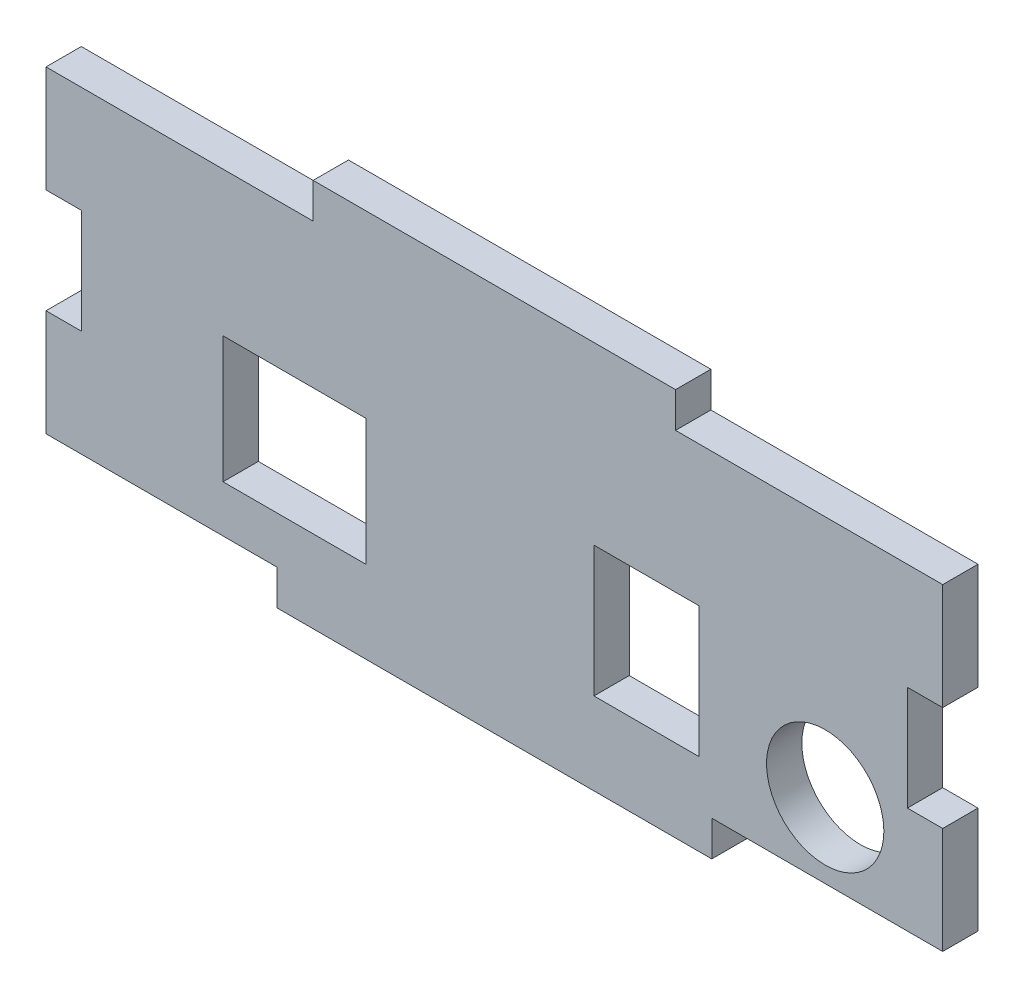
ISO-10303-21;
HEADER;
FILE_DESCRIPTION(('STEP AP214'),'2;1');
FILE_NAME('part.step','',(''),(''),'','','');
FILE_SCHEMA(('AUTOMOTIVE_DESIGN { 1 0 10303 214 1 1 1 1 }'));
ENDSEC;
DATA;
#1=APPLICATION_CONTEXT('core data for automotive mechanical design processes');
#2=APPLICATION_PROTOCOL_DEFINITION('international standard','automotive_design',2000,#1);
#3=PRODUCT_CONTEXT('',#1,'mechanical');
#4=PRODUCT('Part','Part','',(#3));
#5=PRODUCT_RELATED_PRODUCT_CATEGORY('part','',(#4));
#6=PRODUCT_DEFINITION_FORMATION('','',#4);
#7=PRODUCT_DEFINITION_CONTEXT('part definition',#1,'design');
#8=PRODUCT_DEFINITION('design','',#6,#7);
#9=PRODUCT_DEFINITION_SHAPE('','',#8);
#10=(LENGTH_UNIT() NAMED_UNIT(*) SI_UNIT(.MILLI.,.METRE.));
#11=(NAMED_UNIT(*) PLANE_ANGLE_UNIT() SI_UNIT($,.RADIAN.));
#12=(NAMED_UNIT(*) SI_UNIT($,.STERADIAN.) SOLID_ANGLE_UNIT());
#13=UNCERTAINTY_MEASURE_WITH_UNIT(LENGTH_MEASURE(1.E-05),#10,'distance_accuracy_value','');
#14=(GEOMETRIC_REPRESENTATION_CONTEXT(3) GLOBAL_UNCERTAINTY_ASSIGNED_CONTEXT((#13)) GLOBAL_UNIT_ASSIGNED_CONTEXT((#10,
#11,#12)) REPRESENTATION_CONTEXT('',''));
#15=CARTESIAN_POINT('',(0.,0.,0.));
#16=DIRECTION('',(0.,0.,1.));
#17=DIRECTION('',(1.,0.,0.));
#18=AXIS2_PLACEMENT_3D('',#15,#16,#17);
#19=CARTESIAN_POINT('',(-38.1,15.,3.));
#20=DIRECTION('',(0.,-1.,0.));
#21=DIRECTION('',(0.,0.,-1.));
#22=AXIS2_PLACEMENT_3D('',#19,#20,#21);
#23=PLANE('',#22);
#24=DIRECTION('',(0.,0.,1.));
#25=VECTOR('',#24,1.);
#26=CARTESIAN_POINT('',(-15.39875,15.,-30.9432707749197));
#27=LINE('',#26,#25);
#28=CARTESIAN_POINT('',(-15.39875,15.,0.));
#29=VERTEX_POINT('',#28);
#30=CARTESIAN_POINT('',(-15.39875,15.,3.));
#31=VERTEX_POINT('',#30);
#32=EDGE_CURVE('E244',#29,#31,#27,.T.);
#33=ORIENTED_EDGE('',*,*,#32,.F.);
#34=DIRECTION('',(-1.,0.,0.));
#35=VECTOR('',#34,1.);
#36=CARTESIAN_POINT('',(-38.1,15.,0.));
#37=LINE('',#36,#35);
#38=CARTESIAN_POINT('',(-38.1,15.,0.));
#39=VERTEX_POINT('',#38);
#40=EDGE_CURVE('E240',#29,#39,#37,.T.);
#41=ORIENTED_EDGE('',*,*,#40,.T.);
#42=DIRECTION('',(0.,0.,-1.));
#43=VECTOR('',#42,1.);
#44=CARTESIAN_POINT('',(-38.1,15.,3.));
#45=LINE('',#44,#43);
#46=CARTESIAN_POINT('',(-38.1,15.,3.));
#47=VERTEX_POINT('',#46);
#48=EDGE_CURVE('E54',#47,#39,#45,.T.);
#49=ORIENTED_EDGE('',*,*,#48,.F.);
#50=DIRECTION('',(-1.,0.,0.));
#51=VECTOR('',#50,1.);
#52=CARTESIAN_POINT('',(-38.1,15.,3.));
#53=LINE('',#52,#51);
#54=EDGE_CURVE('E488',#31,#47,#53,.T.);
#55=ORIENTED_EDGE('',*,*,#54,.F.);
#56=EDGE_LOOP('',(#33,#41,#49,#55));
#57=FACE_BOUND('',#56,.T.);
#58=ADVANCED_FACE('F45',(#57),#23,.F.);
#59=CARTESIAN_POINT('',(38.1,-15.,3.));
#60=DIRECTION('',(-1.,0.,0.));
#61=DIRECTION('',(0.,0.,1.));
#62=AXIS2_PLACEMENT_3D('',#59,#60,#61);
#63=PLANE('',#62);
#64=DIRECTION('',(0.,1.,0.));
#65=VECTOR('',#64,1.);
#66=CARTESIAN_POINT('',(38.1,-15.,3.));
#67=LINE('',#66,#65);
#68=CARTESIAN_POINT('',(38.1,5.94500000000001,3.));
#69=VERTEX_POINT('',#68);
#70=CARTESIAN_POINT('',(38.1,15.,3.));
#71=VERTEX_POINT('',#70);
#72=EDGE_CURVE('E489',#69,#71,#67,.T.);
#73=ORIENTED_EDGE('',*,*,#72,.F.);
#74=DIRECTION('',(0.,0.,1.));
#75=VECTOR('',#74,1.);
#76=CARTESIAN_POINT('',(38.1,5.94500000000001,-9.38254229939839));
#77=LINE('',#76,#75);
#78=CARTESIAN_POINT('',(38.1,5.94500000000001,0.));
#79=VERTEX_POINT('',#78);
#80=EDGE_CURVE('E277',#79,#69,#77,.T.);
#81=ORIENTED_EDGE('',*,*,#80,.F.);
#82=DIRECTION('',(0.,1.,0.));
#83=VECTOR('',#82,1.);
#84=CARTESIAN_POINT('',(38.1,-15.,0.));
#85=LINE('',#84,#83);
#86=CARTESIAN_POINT('',(38.1,15.,0.));
#87=VERTEX_POINT('',#86);
#88=EDGE_CURVE('E483',#79,#87,#85,.T.);
#89=ORIENTED_EDGE('',*,*,#88,.T.);
#90=DIRECTION('',(0.,0.,-1.));
#91=VECTOR('',#90,1.);
#92=CARTESIAN_POINT('',(38.1,15.,3.));
#93=LINE('',#92,#91);
#94=EDGE_CURVE('E11',#71,#87,#93,.T.);
#95=ORIENTED_EDGE('',*,*,#94,.F.);
#96=EDGE_LOOP('',(#73,#81,#89,#95));
#97=FACE_BOUND('',#96,.T.);
#98=ADVANCED_FACE('F551',(#97),#63,.F.);
#99=CARTESIAN_POINT('',(-38.1,-15.,3.));
#100=DIRECTION('',(1.,0.,0.));
#101=DIRECTION('',(0.,0.,-1.));
#102=AXIS2_PLACEMENT_3D('',#99,#100,#101);
#103=PLANE('',#102);
#104=DIRECTION('',(0.,-1.,0.));
#105=VECTOR('',#104,1.);
#106=CARTESIAN_POINT('',(-38.1,-15.,3.));
#107=LINE('',#106,#105);
#108=CARTESIAN_POINT('',(-38.1,-2.94499999999998,3.));
#109=VERTEX_POINT('',#108);
#110=CARTESIAN_POINT('',(-38.1,-12.,3.));
#111=VERTEX_POINT('',#110);
#112=EDGE_CURVE('E494',#109,#111,#107,.T.);
#113=ORIENTED_EDGE('',*,*,#112,.F.);
#114=DIRECTION('',(0.,0.,1.));
#115=VECTOR('',#114,1.);
#116=CARTESIAN_POINT('',(-38.1,-2.94499999999998,-9.38254229939839));
#117=LINE('',#116,#115);
#118=CARTESIAN_POINT('',(-38.1,-2.94499999999998,0.));
#119=VERTEX_POINT('',#118);
#120=EDGE_CURVE('E307',#119,#109,#117,.T.);
#121=ORIENTED_EDGE('',*,*,#120,.F.);
#122=DIRECTION('',(0.,-1.,0.));
#123=VECTOR('',#122,1.);
#124=CARTESIAN_POINT('',(-38.1,-15.,0.));
#125=LINE('',#124,#123);
#126=CARTESIAN_POINT('',(-38.1,-12.,0.));
#127=VERTEX_POINT('',#126);
#128=EDGE_CURVE('E511',#119,#127,#125,.T.);
#129=ORIENTED_EDGE('',*,*,#128,.T.);
#130=DIRECTION('',(0.,0.,1.));
#131=VECTOR('',#130,1.);
#132=CARTESIAN_POINT('',(-38.1,-12.,-19.8495154159994));
#133=LINE('',#132,#131);
#134=EDGE_CURVE('E361',#127,#111,#133,.T.);
#135=ORIENTED_EDGE('',*,*,#134,.T.);
#136=EDGE_LOOP('',(#113,#121,#129,#135));
#137=FACE_BOUND('',#136,.T.);
#138=ADVANCED_FACE('F589',(#137),#103,.F.);
#139=CARTESIAN_POINT('',(0.,0.,3.));
#140=DIRECTION('',(0.,0.,-1.));
#141=DIRECTION('',(-1.,0.,0.));
#142=AXIS2_PLACEMENT_3D('',#139,#140,#141);
#143=PLANE('',#142);
#144=CARTESIAN_POINT('',(28.115,-5.65,3.));
#145=DIRECTION('',(0.,0.,1.));
#146=DIRECTION('',(1.,0.,0.));
#147=AXIS2_PLACEMENT_3D('',#144,#145,#146);
#148=CIRCLE('',#147,4.98475);
#149=CARTESIAN_POINT('',(33.09975,-5.65,3.));
#150=VERTEX_POINT('',#149);
#151=EDGE_CURVE('E696',#150,#150,#148,.T.);
#152=ORIENTED_EDGE('',*,*,#151,.F.);
#153=EDGE_LOOP('',(#152));
#154=FACE_BOUND('',#153,.T.);
#155=DIRECTION('',(0.,-1.,0.));
#156=VECTOR('',#155,1.);
#157=CARTESIAN_POINT('',(8.4639,-8.0122,3.));
#158=LINE('',#157,#156);
#159=CARTESIAN_POINT('',(8.4639,3.0876,3.));
#160=VERTEX_POINT('',#159);
#161=CARTESIAN_POINT('',(8.4639,-8.0122,3.));
#162=VERTEX_POINT('',#161);
#163=EDGE_CURVE('E441',#160,#162,#158,.T.);
#164=ORIENTED_EDGE('',*,*,#163,.F.);
#165=DIRECTION('',(-1.,0.,0.));
#166=VECTOR('',#165,1.);
#167=CARTESIAN_POINT('',(8.4639,3.0876,3.));
#168=LINE('',#167,#166);
#169=CARTESIAN_POINT('',(17.4047,3.0876,3.));
#170=VERTEX_POINT('',#169);
#171=EDGE_CURVE('E452',#170,#160,#168,.T.);
#172=ORIENTED_EDGE('',*,*,#171,.F.);
#173=DIRECTION('',(0.,1.,0.));
#174=VECTOR('',#173,1.);
#175=CARTESIAN_POINT('',(17.4047,-8.0122,3.));
#176=LINE('',#175,#174);
#177=CARTESIAN_POINT('',(17.4047,-8.0122,3.));
#178=VERTEX_POINT('',#177);
#179=EDGE_CURVE('E448',#178,#170,#176,.T.);
#180=ORIENTED_EDGE('',*,*,#179,.F.);
#181=DIRECTION('',(1.,0.,0.));
#182=VECTOR('',#181,1.);
#183=CARTESIAN_POINT('',(8.4639,-8.0122,3.));
#184=LINE('',#183,#182);
#185=EDGE_CURVE('E444',#162,#178,#184,.T.);
#186=ORIENTED_EDGE('',*,*,#185,.F.);
#187=EDGE_LOOP('',(#164,#172,#180,#186));
#188=FACE_BOUND('',#187,.T.);
#189=DIRECTION('',(0.,1.,0.));
#190=VECTOR('',#189,1.);
#191=CARTESIAN_POINT('',(-35.1,-2.94499999999998,3.));
#192=LINE('',#191,#190);
#193=CARTESIAN_POINT('',(-35.1,-2.94499999999998,3.));
#194=VERTEX_POINT('',#193);
#195=CARTESIAN_POINT('',(-35.1,5.94500000000001,3.));
#196=VERTEX_POINT('',#195);
#197=EDGE_CURVE('E282',#194,#196,#192,.T.);
#198=ORIENTED_EDGE('',*,*,#197,.F.);
#199=DIRECTION('',(1.,0.,0.));
#200=VECTOR('',#199,1.);
#201=CARTESIAN_POINT('',(-38.1,-2.94499999999998,3.));
#202=LINE('',#201,#200);
#203=EDGE_CURVE('E286',#109,#194,#202,.T.);
#204=ORIENTED_EDGE('',*,*,#203,.F.);
#205=ORIENTED_EDGE('',*,*,#112,.T.);
#206=DIRECTION('',(-1.,0.,0.));
#207=VECTOR('',#206,1.);
#208=CARTESIAN_POINT('',(-38.1,-12.,3.));
#209=LINE('',#208,#207);
#210=CARTESIAN_POINT('',(-18.4785,-12.,3.));
#211=VERTEX_POINT('',#210);
#212=EDGE_CURVE('E347',#211,#111,#209,.T.);
#213=ORIENTED_EDGE('',*,*,#212,.F.);
#214=DIRECTION('',(0.,1.,0.));
#215=VECTOR('',#214,1.);
#216=CARTESIAN_POINT('',(-18.4785,-15.,3.));
#217=LINE('',#216,#215);
#218=CARTESIAN_POINT('',(-18.4785,-15.,3.));
#219=VERTEX_POINT('',#218);
#220=EDGE_CURVE('E352',#219,#211,#217,.T.);
#221=ORIENTED_EDGE('',*,*,#220,.F.);
#222=DIRECTION('',(1.,0.,0.));
#223=VECTOR('',#222,1.);
#224=CARTESIAN_POINT('',(-38.1,-15.,3.));
#225=LINE('',#224,#223);
#226=CARTESIAN_POINT('',(18.4785,-15.,3.));
#227=VERTEX_POINT('',#226);
#228=EDGE_CURVE('E499',#219,#227,#225,.T.);
#229=ORIENTED_EDGE('',*,*,#228,.T.);
#230=DIRECTION('',(0.,-1.,0.));
#231=VECTOR('',#230,1.);
#232=CARTESIAN_POINT('',(18.4785,-15.,3.));
#233=LINE('',#232,#231);
#234=CARTESIAN_POINT('',(18.4785,-12.,3.));
#235=VERTEX_POINT('',#234);
#236=EDGE_CURVE('E356',#235,#227,#233,.T.);
#237=ORIENTED_EDGE('',*,*,#236,.F.);
#238=DIRECTION('',(-1.,0.,0.));
#239=VECTOR('',#238,1.);
#240=CARTESIAN_POINT('',(18.4785,-12.,3.));
#241=LINE('',#240,#239);
#242=CARTESIAN_POINT('',(38.1,-12.,3.));
#243=VERTEX_POINT('',#242);
#244=EDGE_CURVE('E382',#243,#235,#241,.T.);
#245=ORIENTED_EDGE('',*,*,#244,.F.);
#246=CARTESIAN_POINT('',(38.1,-2.94499999999999,3.));
#247=VERTEX_POINT('',#246);
#248=EDGE_CURVE('E484',#243,#247,#67,.T.);
#249=ORIENTED_EDGE('',*,*,#248,.T.);
#250=DIRECTION('',(1.,0.,0.));
#251=VECTOR('',#250,1.);
#252=CARTESIAN_POINT('',(38.1,-2.94499999999999,3.));
#253=LINE('',#252,#251);
#254=CARTESIAN_POINT('',(35.1,-2.94499999999999,3.));
#255=VERTEX_POINT('',#254);
#256=EDGE_CURVE('E69',#255,#247,#253,.T.);
#257=ORIENTED_EDGE('',*,*,#256,.F.);
#258=DIRECTION('',(0.,-1.,0.));
#259=VECTOR('',#258,1.);
#260=CARTESIAN_POINT('',(35.1,5.94500000000001,3.));
#261=LINE('',#260,#259);
#262=CARTESIAN_POINT('',(35.1,5.94500000000001,3.));
#263=VERTEX_POINT('',#262);
#264=EDGE_CURVE('E341',#263,#255,#261,.T.);
#265=ORIENTED_EDGE('',*,*,#264,.F.);
#266=DIRECTION('',(-1.,0.,0.));
#267=VECTOR('',#266,1.);
#268=CARTESIAN_POINT('',(38.1,5.94500000000001,3.));
#269=LINE('',#268,#267);
#270=EDGE_CURVE('E290',#69,#263,#269,.T.);
#271=ORIENTED_EDGE('',*,*,#270,.F.);
#272=ORIENTED_EDGE('',*,*,#72,.T.);
#273=CARTESIAN_POINT('',(15.39875,15.,3.));
#274=VERTEX_POINT('',#273);
#275=EDGE_CURVE('E490',#71,#274,#53,.T.);
#276=ORIENTED_EDGE('',*,*,#275,.T.);
#277=DIRECTION('',(0.,1.,0.));
#278=VECTOR('',#277,1.);
#279=CARTESIAN_POINT('',(15.39875,18.,3.));
#280=LINE('',#279,#278);
#281=CARTESIAN_POINT('',(15.39875,18.,3.));
#282=VERTEX_POINT('',#281);
#283=EDGE_CURVE('E61',#274,#282,#280,.T.);
#284=ORIENTED_EDGE('',*,*,#283,.T.);
#285=DIRECTION('',(-1.,0.,0.));
#286=VECTOR('',#285,1.);
#287=CARTESIAN_POINT('',(-15.39875,18.,3.));
#288=LINE('',#287,#286);
#289=CARTESIAN_POINT('',(-15.39875,18.,3.));
#290=VERTEX_POINT('',#289);
#291=EDGE_CURVE('E262',#282,#290,#288,.T.);
#292=ORIENTED_EDGE('',*,*,#291,.T.);
#293=DIRECTION('',(0.,-1.,0.));
#294=VECTOR('',#293,1.);
#295=CARTESIAN_POINT('',(-15.39875,18.,3.));
#296=LINE('',#295,#294);
#297=EDGE_CURVE('E250',#290,#31,#296,.T.);
#298=ORIENTED_EDGE('',*,*,#297,.T.);
#299=ORIENTED_EDGE('',*,*,#54,.T.);
#300=CARTESIAN_POINT('',(-38.1,5.94500000000001,3.));
#301=VERTEX_POINT('',#300);
#302=EDGE_CURVE('E495',#47,#301,#107,.T.);
#303=ORIENTED_EDGE('',*,*,#302,.T.);
#304=DIRECTION('',(-1.,0.,0.));
#305=VECTOR('',#304,1.);
#306=CARTESIAN_POINT('',(-38.1,5.94500000000001,3.));
#307=LINE('',#306,#305);
#308=EDGE_CURVE('E278',#196,#301,#307,.T.);
#309=ORIENTED_EDGE('',*,*,#308,.F.);
#310=EDGE_LOOP('',(#198,#204,#205,#213,#221,#229,#237,#245,#249,#257,#265,#271,#272,#276,#284,
#292,#298,#299,#303,#309));
#311=FACE_BOUND('',#310,.T.);
#312=DIRECTION('',(0.,-1.,0.));
#313=VECTOR('',#312,1.);
#314=CARTESIAN_POINT('',(-23.0575,-8.0122,3.));
#315=LINE('',#314,#313);
#316=CARTESIAN_POINT('',(-23.0575,2.732,3.));
#317=VERTEX_POINT('',#316);
#318=CARTESIAN_POINT('',(-23.0575,-8.0122,3.));
#319=VERTEX_POINT('',#318);
#320=EDGE_CURVE('E398',#317,#319,#315,.T.);
#321=ORIENTED_EDGE('',*,*,#320,.F.);
#322=DIRECTION('',(-1.,0.,0.));
#323=VECTOR('',#322,1.);
#324=CARTESIAN_POINT('',(-23.0575,2.732,3.));
#325=LINE('',#324,#323);
#326=CARTESIAN_POINT('',(-10.9036,2.732,3.));
#327=VERTEX_POINT('',#326);
#328=EDGE_CURVE('E409',#327,#317,#325,.T.);
#329=ORIENTED_EDGE('',*,*,#328,.F.);
#330=DIRECTION('',(0.,1.,0.));
#331=VECTOR('',#330,1.);
#332=CARTESIAN_POINT('',(-10.9036,-8.0122,3.));
#333=LINE('',#332,#331);
#334=CARTESIAN_POINT('',(-10.9036,-8.0122,3.));
#335=VERTEX_POINT('',#334);
#336=EDGE_CURVE('E405',#335,#327,#333,.T.);
#337=ORIENTED_EDGE('',*,*,#336,.F.);
#338=DIRECTION('',(1.,0.,0.));
#339=VECTOR('',#338,1.);
#340=CARTESIAN_POINT('',(-23.0575,-8.0122,3.));
#341=LINE('',#340,#339);
#342=EDGE_CURVE('E401',#319,#335,#341,.T.);
#343=ORIENTED_EDGE('',*,*,#342,.F.);
#344=EDGE_LOOP('',(#321,#329,#337,#343));
#345=FACE_BOUND('',#344,.T.);
#346=ADVANCED_FACE('F537',(#154,#188,#311,#345),#143,.F.);
#347=CARTESIAN_POINT('',(0.,0.,0.));
#348=DIRECTION('',(0.,0.,-1.));
#349=DIRECTION('',(-1.,0.,0.));
#350=AXIS2_PLACEMENT_3D('',#347,#348,#349);
#351=PLANE('',#350);
#352=CARTESIAN_POINT('',(28.115,-5.65,0.));
#353=DIRECTION('',(0.,0.,-1.));
#354=DIRECTION('',(-1.,0.,0.));
#355=AXIS2_PLACEMENT_3D('',#352,#353,#354);
#356=CIRCLE('',#355,4.98475);
#357=CARTESIAN_POINT('',(23.13025,-5.65,0.));
#358=VERTEX_POINT('',#357);
#359=EDGE_CURVE('E698',#358,#358,#356,.F.);
#360=ORIENTED_EDGE('',*,*,#359,.T.);
#361=EDGE_LOOP('',(#360));
#362=FACE_BOUND('',#361,.T.);
#363=DIRECTION('',(1.,0.,0.));
#364=VECTOR('',#363,1.);
#365=CARTESIAN_POINT('',(-38.1,-2.94499999999998,0.));
#366=LINE('',#365,#364);
#367=CARTESIAN_POINT('',(-35.1,-2.94499999999998,0.));
#368=VERTEX_POINT('',#367);
#369=EDGE_CURVE('E281',#119,#368,#366,.T.);
#370=ORIENTED_EDGE('',*,*,#369,.T.);
#371=DIRECTION('',(0.,1.,0.));
#372=VECTOR('',#371,1.);
#373=CARTESIAN_POINT('',(-35.1,-2.94499999999998,0.));
#374=LINE('',#373,#372);
#375=CARTESIAN_POINT('',(-35.1,5.94500000000001,0.));
#376=VERTEX_POINT('',#375);
#377=EDGE_CURVE('E300',#368,#376,#374,.T.);
#378=ORIENTED_EDGE('',*,*,#377,.T.);
#379=DIRECTION('',(-1.,0.,0.));
#380=VECTOR('',#379,1.);
#381=CARTESIAN_POINT('',(-38.1,5.94500000000001,0.));
#382=LINE('',#381,#380);
#383=CARTESIAN_POINT('',(-38.1,5.94500000000001,0.));
#384=VERTEX_POINT('',#383);
#385=EDGE_CURVE('E294',#376,#384,#382,.T.);
#386=ORIENTED_EDGE('',*,*,#385,.T.);
#387=EDGE_CURVE('E512',#39,#384,#125,.T.);
#388=ORIENTED_EDGE('',*,*,#387,.F.);
#389=ORIENTED_EDGE('',*,*,#40,.F.);
#390=DIRECTION('',(0.,-1.,0.));
#391=VECTOR('',#390,1.);
#392=CARTESIAN_POINT('',(-15.39875,18.,0.));
#393=LINE('',#392,#391);
#394=CARTESIAN_POINT('',(-15.39875,18.,0.));
#395=VERTEX_POINT('',#394);
#396=EDGE_CURVE('E231',#395,#29,#393,.T.);
#397=ORIENTED_EDGE('',*,*,#396,.F.);
#398=DIRECTION('',(-1.,0.,0.));
#399=VECTOR('',#398,1.);
#400=CARTESIAN_POINT('',(-15.39875,18.,0.));
#401=LINE('',#400,#399);
#402=CARTESIAN_POINT('',(15.39875,18.,0.));
#403=VERTEX_POINT('',#402);
#404=EDGE_CURVE('E237',#403,#395,#401,.T.);
#405=ORIENTED_EDGE('',*,*,#404,.F.);
#406=DIRECTION('',(0.,1.,0.));
#407=VECTOR('',#406,1.);
#408=CARTESIAN_POINT('',(15.39875,18.,0.));
#409=LINE('',#408,#407);
#410=CARTESIAN_POINT('',(15.39875,15.,0.));
#411=VERTEX_POINT('',#410);
#412=EDGE_CURVE('E267',#411,#403,#409,.T.);
#413=ORIENTED_EDGE('',*,*,#412,.F.);
#414=EDGE_CURVE('E507',#87,#411,#37,.T.);
#415=ORIENTED_EDGE('',*,*,#414,.F.);
#416=ORIENTED_EDGE('',*,*,#88,.F.);
#417=DIRECTION('',(-1.,0.,0.));
#418=VECTOR('',#417,1.);
#419=CARTESIAN_POINT('',(38.1,5.94500000000001,0.));
#420=LINE('',#419,#418);
#421=CARTESIAN_POINT('',(35.1,5.94500000000001,0.));
#422=VERTEX_POINT('',#421);
#423=EDGE_CURVE('E321',#79,#422,#420,.T.);
#424=ORIENTED_EDGE('',*,*,#423,.T.);
#425=DIRECTION('',(0.,-1.,0.));
#426=VECTOR('',#425,1.);
#427=CARTESIAN_POINT('',(35.1,5.94500000000001,0.));
#428=LINE('',#427,#426);
#429=CARTESIAN_POINT('',(35.1,-2.94499999999999,0.));
#430=VERTEX_POINT('',#429);
#431=EDGE_CURVE('E322',#422,#430,#428,.T.);
#432=ORIENTED_EDGE('',*,*,#431,.T.);
#433=DIRECTION('',(1.,0.,0.));
#434=VECTOR('',#433,1.);
#435=CARTESIAN_POINT('',(38.1,-2.94499999999999,0.));
#436=LINE('',#435,#434);
#437=CARTESIAN_POINT('',(38.1,-2.94499999999999,0.));
#438=VERTEX_POINT('',#437);
#439=EDGE_CURVE('E326',#430,#438,#436,.T.);
#440=ORIENTED_EDGE('',*,*,#439,.T.);
#441=CARTESIAN_POINT('',(38.1,-12.,0.));
#442=VERTEX_POINT('',#441);
#443=EDGE_CURVE('E503',#442,#438,#85,.T.);
#444=ORIENTED_EDGE('',*,*,#443,.F.);
#445=DIRECTION('',(-1.,0.,0.));
#446=VECTOR('',#445,1.);
#447=CARTESIAN_POINT('',(18.4785,-12.,0.));
#448=LINE('',#447,#446);
#449=CARTESIAN_POINT('',(18.4785,-12.,0.));
#450=VERTEX_POINT('',#449);
#451=EDGE_CURVE('E383',#442,#450,#448,.T.);
#452=ORIENTED_EDGE('',*,*,#451,.T.);
#453=DIRECTION('',(0.,-1.,0.));
#454=VECTOR('',#453,1.);
#455=CARTESIAN_POINT('',(18.4785,-15.,0.));
#456=LINE('',#455,#454);
#457=CARTESIAN_POINT('',(18.4785,-15.,0.));
#458=VERTEX_POINT('',#457);
#459=EDGE_CURVE('E378',#450,#458,#456,.T.);
#460=ORIENTED_EDGE('',*,*,#459,.T.);
#461=DIRECTION('',(1.,0.,0.));
#462=VECTOR('',#461,1.);
#463=CARTESIAN_POINT('',(-38.1,-15.,0.));
#464=LINE('',#463,#462);
#465=CARTESIAN_POINT('',(-18.4785,-15.,0.));
#466=VERTEX_POINT('',#465);
#467=EDGE_CURVE('E516',#466,#458,#464,.T.);
#468=ORIENTED_EDGE('',*,*,#467,.F.);
#469=DIRECTION('',(0.,1.,0.));
#470=VECTOR('',#469,1.);
#471=CARTESIAN_POINT('',(-18.4785,-15.,0.));
#472=LINE('',#471,#470);
#473=CARTESIAN_POINT('',(-18.4785,-12.,0.));
#474=VERTEX_POINT('',#473);
#475=EDGE_CURVE('E363',#466,#474,#472,.T.);
#476=ORIENTED_EDGE('',*,*,#475,.T.);
#477=DIRECTION('',(-1.,0.,0.));
#478=VECTOR('',#477,1.);
#479=CARTESIAN_POINT('',(-38.1,-12.,0.));
#480=LINE('',#479,#478);
#481=EDGE_CURVE('E357',#474,#127,#480,.T.);
#482=ORIENTED_EDGE('',*,*,#481,.T.);
#483=ORIENTED_EDGE('',*,*,#128,.F.);
#484=EDGE_LOOP('',(#370,#378,#386,#388,#389,#397,#405,#413,#415,#416,#424,#432,#440,#444,#452,
#460,#468,#476,#482,#483));
#485=FACE_BOUND('',#484,.T.);
#486=DIRECTION('',(-1.,0.,0.));
#487=VECTOR('',#486,1.);
#488=CARTESIAN_POINT('',(8.4639,3.0876,0.));
#489=LINE('',#488,#487);
#490=CARTESIAN_POINT('',(17.4047,3.0876,0.));
#491=VERTEX_POINT('',#490);
#492=CARTESIAN_POINT('',(8.4639,3.0876,0.));
#493=VERTEX_POINT('',#492);
#494=EDGE_CURVE('E445',#491,#493,#489,.T.);
#495=ORIENTED_EDGE('',*,*,#494,.T.);
#496=DIRECTION('',(0.,-1.,0.));
#497=VECTOR('',#496,1.);
#498=CARTESIAN_POINT('',(8.4639,-8.0122,0.));
#499=LINE('',#498,#497);
#500=CARTESIAN_POINT('',(8.4639,-8.0122,0.));
#501=VERTEX_POINT('',#500);
#502=EDGE_CURVE('E440',#493,#501,#499,.T.);
#503=ORIENTED_EDGE('',*,*,#502,.T.);
#504=DIRECTION('',(1.,0.,0.));
#505=VECTOR('',#504,1.);
#506=CARTESIAN_POINT('',(8.4639,-8.0122,0.));
#507=LINE('',#506,#505);
#508=CARTESIAN_POINT('',(17.4047,-8.0122,0.));
#509=VERTEX_POINT('',#508);
#510=EDGE_CURVE('E459',#501,#509,#507,.T.);
#511=ORIENTED_EDGE('',*,*,#510,.T.);
#512=DIRECTION('',(0.,1.,0.));
#513=VECTOR('',#512,1.);
#514=CARTESIAN_POINT('',(17.4047,-8.0122,0.));
#515=LINE('',#514,#513);
#516=EDGE_CURVE('E463',#509,#491,#515,.T.);
#517=ORIENTED_EDGE('',*,*,#516,.T.);
#518=EDGE_LOOP('',(#495,#503,#511,#517));
#519=FACE_BOUND('',#518,.T.);
#520=DIRECTION('',(-1.,0.,0.));
#521=VECTOR('',#520,1.);
#522=CARTESIAN_POINT('',(-23.0575,2.732,0.));
#523=LINE('',#522,#521);
#524=CARTESIAN_POINT('',(-10.9036,2.732,0.));
#525=VERTEX_POINT('',#524);
#526=CARTESIAN_POINT('',(-23.0575,2.732,0.));
#527=VERTEX_POINT('',#526);
#528=EDGE_CURVE('E402',#525,#527,#523,.T.);
#529=ORIENTED_EDGE('',*,*,#528,.T.);
#530=DIRECTION('',(0.,-1.,0.));
#531=VECTOR('',#530,1.);
#532=CARTESIAN_POINT('',(-23.0575,-8.0122,0.));
#533=LINE('',#532,#531);
#534=CARTESIAN_POINT('',(-23.0575,-8.0122,0.));
#535=VERTEX_POINT('',#534);
#536=EDGE_CURVE('E370',#527,#535,#533,.T.);
#537=ORIENTED_EDGE('',*,*,#536,.T.);
#538=DIRECTION('',(1.,0.,0.));
#539=VECTOR('',#538,1.);
#540=CARTESIAN_POINT('',(-23.0575,-8.0122,0.));
#541=LINE('',#540,#539);
#542=CARTESIAN_POINT('',(-10.9036,-8.0122,0.));
#543=VERTEX_POINT('',#542);
#544=EDGE_CURVE('E416',#535,#543,#541,.T.);
#545=ORIENTED_EDGE('',*,*,#544,.T.);
#546=DIRECTION('',(0.,1.,0.));
#547=VECTOR('',#546,1.);
#548=CARTESIAN_POINT('',(-10.9036,-8.0122,0.));
#549=LINE('',#548,#547);
#550=EDGE_CURVE('E420',#543,#525,#549,.T.);
#551=ORIENTED_EDGE('',*,*,#550,.T.);
#552=EDGE_LOOP('',(#529,#537,#545,#551));
#553=FACE_BOUND('',#552,.T.);
#554=ADVANCED_FACE('F234',(#362,#485,#519,#553),#351,.T.);
#555=ORIENTED_EDGE('',*,*,#443,.T.);
#556=DIRECTION('',(0.,0.,1.));
#557=VECTOR('',#556,1.);
#558=CARTESIAN_POINT('',(38.1,-2.94499999999999,-9.38254229939839));
#559=LINE('',#558,#557);
#560=EDGE_CURVE('E317',#438,#247,#559,.T.);
#561=ORIENTED_EDGE('',*,*,#560,.T.);
#562=ORIENTED_EDGE('',*,*,#248,.F.);
#563=DIRECTION('',(0.,0.,1.));
#564=VECTOR('',#563,1.);
#565=CARTESIAN_POINT('',(38.1,-12.,-19.8495154159994));
#566=LINE('',#565,#564);
#567=EDGE_CURVE('E379',#442,#243,#566,.T.);
#568=ORIENTED_EDGE('',*,*,#567,.F.);
#569=EDGE_LOOP('',(#555,#561,#562,#568));
#570=FACE_BOUND('',#569,.T.);
#571=ADVANCED_FACE('F47',(#570),#63,.F.);
#572=ORIENTED_EDGE('',*,*,#414,.T.);
#573=DIRECTION('',(0.,0.,1.));
#574=VECTOR('',#573,1.);
#575=CARTESIAN_POINT('',(15.39875,15.,-30.9432707749197));
#576=LINE('',#575,#574);
#577=EDGE_CURVE('E269',#411,#274,#576,.T.);
#578=ORIENTED_EDGE('',*,*,#577,.T.);
#579=ORIENTED_EDGE('',*,*,#275,.F.);
#580=ORIENTED_EDGE('',*,*,#94,.T.);
#581=EDGE_LOOP('',(#572,#578,#579,#580));
#582=FACE_BOUND('',#581,.T.);
#583=ADVANCED_FACE('F554',(#582),#23,.F.);
#584=ORIENTED_EDGE('',*,*,#387,.T.);
#585=DIRECTION('',(0.,0.,1.));
#586=VECTOR('',#585,1.);
#587=CARTESIAN_POINT('',(-38.1,5.94500000000001,-9.38254229939839));
#588=LINE('',#587,#586);
#589=EDGE_CURVE('E298',#384,#301,#588,.T.);
#590=ORIENTED_EDGE('',*,*,#589,.T.);
#591=ORIENTED_EDGE('',*,*,#302,.F.);
#592=ORIENTED_EDGE('',*,*,#48,.T.);
#593=EDGE_LOOP('',(#584,#590,#591,#592));
#594=FACE_BOUND('',#593,.T.);
#595=ADVANCED_FACE('F524',(#594),#103,.F.);
#596=CARTESIAN_POINT('',(-38.1,-15.,3.));
#597=DIRECTION('',(0.,1.,0.));
#598=DIRECTION('',(0.,0.,1.));
#599=AXIS2_PLACEMENT_3D('',#596,#597,#598);
#600=PLANE('',#599);
#601=ORIENTED_EDGE('',*,*,#228,.F.);
#602=DIRECTION('',(0.,0.,1.));
#603=VECTOR('',#602,1.);
#604=CARTESIAN_POINT('',(-18.4785,-15.,-19.8495154159994));
#605=LINE('',#604,#603);
#606=EDGE_CURVE('E351',#466,#219,#605,.T.);
#607=ORIENTED_EDGE('',*,*,#606,.F.);
#608=ORIENTED_EDGE('',*,*,#467,.T.);
#609=DIRECTION('',(0.,0.,1.));
#610=VECTOR('',#609,1.);
#611=CARTESIAN_POINT('',(18.4785,-15.,-19.8495154159994));
#612=LINE('',#611,#610);
#613=EDGE_CURVE('E314',#458,#227,#612,.T.);
#614=ORIENTED_EDGE('',*,*,#613,.T.);
#615=EDGE_LOOP('',(#601,#607,#608,#614));
#616=FACE_BOUND('',#615,.T.);
#617=ADVANCED_FACE('F578',(#616),#600,.F.);
#618=CARTESIAN_POINT('',(8.4639,-8.0122,3.));
#619=DIRECTION('',(1.,0.,0.));
#620=DIRECTION('',(0.,0.,-1.));
#621=AXIS2_PLACEMENT_3D('',#618,#619,#620);
#622=PLANE('',#621);
#623=ORIENTED_EDGE('',*,*,#502,.F.);
#624=DIRECTION('',(0.,0.,-1.));
#625=VECTOR('',#624,1.);
#626=CARTESIAN_POINT('',(8.4639,3.0876,3.));
#627=LINE('',#626,#625);
#628=EDGE_CURVE('E455',#160,#493,#627,.T.);
#629=ORIENTED_EDGE('',*,*,#628,.F.);
#630=ORIENTED_EDGE('',*,*,#163,.T.);
#631=DIRECTION('',(0.,0.,-1.));
#632=VECTOR('',#631,1.);
#633=CARTESIAN_POINT('',(8.4639,-8.0122,3.));
#634=LINE('',#633,#632);
#635=EDGE_CURVE('E479',#162,#501,#634,.T.);
#636=ORIENTED_EDGE('',*,*,#635,.T.);
#637=EDGE_LOOP('',(#623,#629,#630,#636));
#638=FACE_BOUND('',#637,.T.);
#639=ADVANCED_FACE('F627',(#638),#622,.T.);
#640=CARTESIAN_POINT('',(8.4639,-8.0122,3.));
#641=DIRECTION('',(0.,1.,0.));
#642=DIRECTION('',(0.,0.,1.));
#643=AXIS2_PLACEMENT_3D('',#640,#641,#642);
#644=PLANE('',#643);
#645=ORIENTED_EDGE('',*,*,#510,.F.);
#646=ORIENTED_EDGE('',*,*,#635,.F.);
#647=ORIENTED_EDGE('',*,*,#185,.T.);
#648=DIRECTION('',(0.,0.,-1.));
#649=VECTOR('',#648,1.);
#650=CARTESIAN_POINT('',(17.4047,-8.0122,3.));
#651=LINE('',#650,#649);
#652=EDGE_CURVE('E476',#178,#509,#651,.T.);
#653=ORIENTED_EDGE('',*,*,#652,.T.);
#654=EDGE_LOOP('',(#645,#646,#647,#653));
#655=FACE_BOUND('',#654,.T.);
#656=ADVANCED_FACE('F631',(#655),#644,.T.);
#657=CARTESIAN_POINT('',(17.4047,-8.0122,3.));
#658=DIRECTION('',(-1.,0.,0.));
#659=DIRECTION('',(0.,0.,1.));
#660=AXIS2_PLACEMENT_3D('',#657,#658,#659);
#661=PLANE('',#660);
#662=ORIENTED_EDGE('',*,*,#516,.F.);
#663=ORIENTED_EDGE('',*,*,#652,.F.);
#664=ORIENTED_EDGE('',*,*,#179,.T.);
#665=DIRECTION('',(0.,0.,-1.));
#666=VECTOR('',#665,1.);
#667=CARTESIAN_POINT('',(17.4047,3.0876,3.));
#668=LINE('',#667,#666);
#669=EDGE_CURVE('E473',#170,#491,#668,.T.);
#670=ORIENTED_EDGE('',*,*,#669,.T.);
#671=EDGE_LOOP('',(#662,#663,#664,#670));
#672=FACE_BOUND('',#671,.T.);
#673=ADVANCED_FACE('F636',(#672),#661,.T.);
#674=CARTESIAN_POINT('',(8.4639,3.0876,3.));
#675=DIRECTION('',(0.,-1.,0.));
#676=DIRECTION('',(0.,0.,-1.));
#677=AXIS2_PLACEMENT_3D('',#674,#675,#676);
#678=PLANE('',#677);
#679=ORIENTED_EDGE('',*,*,#494,.F.);
#680=ORIENTED_EDGE('',*,*,#669,.F.);
#681=ORIENTED_EDGE('',*,*,#171,.T.);
#682=ORIENTED_EDGE('',*,*,#628,.T.);
#683=EDGE_LOOP('',(#679,#680,#681,#682));
#684=FACE_BOUND('',#683,.T.);
#685=ADVANCED_FACE('F642',(#684),#678,.T.);
#686=CARTESIAN_POINT('',(-23.0575,-8.0122,3.));
#687=DIRECTION('',(1.,0.,0.));
#688=DIRECTION('',(0.,1.,0.));
#689=AXIS2_PLACEMENT_3D('',#686,#687,#688);
#690=PLANE('',#689);
#691=ORIENTED_EDGE('',*,*,#536,.F.);
#692=DIRECTION('',(0.,0.,-1.));
#693=VECTOR('',#692,1.);
#694=CARTESIAN_POINT('',(-23.0575,2.732,3.));
#695=LINE('',#694,#693);
#696=EDGE_CURVE('E412',#317,#527,#695,.T.);
#697=ORIENTED_EDGE('',*,*,#696,.F.);
#698=ORIENTED_EDGE('',*,*,#320,.T.);
#699=DIRECTION('',(0.,0.,-1.));
#700=VECTOR('',#699,1.);
#701=CARTESIAN_POINT('',(-23.0575,-8.0122,3.));
#702=LINE('',#701,#700);
#703=EDGE_CURVE('E436',#319,#535,#702,.T.);
#704=ORIENTED_EDGE('',*,*,#703,.T.);
#705=EDGE_LOOP('',(#691,#697,#698,#704));
#706=FACE_BOUND('',#705,.T.);
#707=ADVANCED_FACE('F646',(#706),#690,.T.);
#708=CARTESIAN_POINT('',(-23.0575,-8.0122,3.));
#709=DIRECTION('',(0.,1.,0.));
#710=DIRECTION('',(0.,0.,1.));
#711=AXIS2_PLACEMENT_3D('',#708,#709,#710);
#712=PLANE('',#711);
#713=ORIENTED_EDGE('',*,*,#544,.F.);
#714=ORIENTED_EDGE('',*,*,#703,.F.);
#715=ORIENTED_EDGE('',*,*,#342,.T.);
#716=DIRECTION('',(0.,0.,-1.));
#717=VECTOR('',#716,1.);
#718=CARTESIAN_POINT('',(-10.9036,-8.0122,3.));
#719=LINE('',#718,#717);
#720=EDGE_CURVE('E433',#335,#543,#719,.T.);
#721=ORIENTED_EDGE('',*,*,#720,.T.);
#722=EDGE_LOOP('',(#713,#714,#715,#721));
#723=FACE_BOUND('',#722,.T.);
#724=ADVANCED_FACE('F650',(#723),#712,.T.);
#725=CARTESIAN_POINT('',(-10.9036,-8.0122,3.));
#726=DIRECTION('',(-1.,0.,0.));
#727=DIRECTION('',(0.,0.,1.));
#728=AXIS2_PLACEMENT_3D('',#725,#726,#727);
#729=PLANE('',#728);
#730=ORIENTED_EDGE('',*,*,#550,.F.);
#731=ORIENTED_EDGE('',*,*,#720,.F.);
#732=ORIENTED_EDGE('',*,*,#336,.T.);
#733=DIRECTION('',(0.,0.,-1.));
#734=VECTOR('',#733,1.);
#735=CARTESIAN_POINT('',(-10.9036,2.732,3.));
#736=LINE('',#735,#734);
#737=EDGE_CURVE('E430',#327,#525,#736,.T.);
#738=ORIENTED_EDGE('',*,*,#737,.T.);
#739=EDGE_LOOP('',(#730,#731,#732,#738));
#740=FACE_BOUND('',#739,.T.);
#741=ADVANCED_FACE('F654',(#740),#729,.T.);
#742=CARTESIAN_POINT('',(-23.0575,2.732,3.));
#743=DIRECTION('',(0.,-1.,0.));
#744=DIRECTION('',(0.,0.,-1.));
#745=AXIS2_PLACEMENT_3D('',#742,#743,#744);
#746=PLANE('',#745);
#747=ORIENTED_EDGE('',*,*,#528,.F.);
#748=ORIENTED_EDGE('',*,*,#737,.F.);
#749=ORIENTED_EDGE('',*,*,#328,.T.);
#750=ORIENTED_EDGE('',*,*,#696,.T.);
#751=EDGE_LOOP('',(#747,#748,#749,#750));
#752=FACE_BOUND('',#751,.T.);
#753=ADVANCED_FACE('F658',(#752),#746,.T.);
#754=CARTESIAN_POINT('',(18.4785,-12.,-19.8495154159994));
#755=DIRECTION('',(0.,1.,0.));
#756=DIRECTION('',(0.,0.,1.));
#757=AXIS2_PLACEMENT_3D('',#754,#755,#756);
#758=PLANE('',#757);
#759=ORIENTED_EDGE('',*,*,#567,.T.);
#760=ORIENTED_EDGE('',*,*,#244,.T.);
#761=DIRECTION('',(0.,0.,1.));
#762=VECTOR('',#761,1.);
#763=CARTESIAN_POINT('',(18.4785,-12.,-19.8495154159994));
#764=LINE('',#763,#762);
#765=EDGE_CURVE('E384',#450,#235,#764,.T.);
#766=ORIENTED_EDGE('',*,*,#765,.F.);
#767=ORIENTED_EDGE('',*,*,#451,.F.);
#768=EDGE_LOOP('',(#759,#760,#766,#767));
#769=FACE_BOUND('',#768,.T.);
#770=ADVANCED_FACE('F572',(#769),#758,.F.);
#771=CARTESIAN_POINT('',(18.4785,-15.,-19.8495154159994));
#772=DIRECTION('',(-1.,0.,0.));
#773=DIRECTION('',(0.,0.,1.));
#774=AXIS2_PLACEMENT_3D('',#771,#772,#773);
#775=PLANE('',#774);
#776=ORIENTED_EDGE('',*,*,#765,.T.);
#777=ORIENTED_EDGE('',*,*,#236,.T.);
#778=ORIENTED_EDGE('',*,*,#613,.F.);
#779=ORIENTED_EDGE('',*,*,#459,.F.);
#780=EDGE_LOOP('',(#776,#777,#778,#779));
#781=FACE_BOUND('',#780,.T.);
#782=ADVANCED_FACE('F663',(#781),#775,.F.);
#783=CARTESIAN_POINT('',(-18.4785,-15.,-19.8495154159994));
#784=DIRECTION('',(1.,0.,0.));
#785=DIRECTION('',(0.,0.,-1.));
#786=AXIS2_PLACEMENT_3D('',#783,#784,#785);
#787=PLANE('',#786);
#788=ORIENTED_EDGE('',*,*,#606,.T.);
#789=ORIENTED_EDGE('',*,*,#220,.T.);
#790=DIRECTION('',(0.,0.,1.));
#791=VECTOR('',#790,1.);
#792=CARTESIAN_POINT('',(-18.4785,-12.,-19.8495154159994));
#793=LINE('',#792,#791);
#794=EDGE_CURVE('E362',#474,#211,#793,.T.);
#795=ORIENTED_EDGE('',*,*,#794,.F.);
#796=ORIENTED_EDGE('',*,*,#475,.F.);
#797=EDGE_LOOP('',(#788,#789,#795,#796));
#798=FACE_BOUND('',#797,.T.);
#799=ADVANCED_FACE('F581',(#798),#787,.F.);
#800=CARTESIAN_POINT('',(-38.1,-12.,-19.8495154159994));
#801=DIRECTION('',(0.,1.,0.));
#802=DIRECTION('',(-1.,0.,0.));
#803=AXIS2_PLACEMENT_3D('',#800,#801,#802);
#804=PLANE('',#803);
#805=ORIENTED_EDGE('',*,*,#794,.T.);
#806=ORIENTED_EDGE('',*,*,#212,.T.);
#807=ORIENTED_EDGE('',*,*,#134,.F.);
#808=ORIENTED_EDGE('',*,*,#481,.F.);
#809=EDGE_LOOP('',(#805,#806,#807,#808));
#810=FACE_BOUND('',#809,.T.);
#811=ADVANCED_FACE('F587',(#810),#804,.F.);
#812=CARTESIAN_POINT('',(-38.1,-2.94499999999998,-9.38254229939839));
#813=DIRECTION('',(0.,-1.,0.));
#814=DIRECTION('',(0.,0.,-1.));
#815=AXIS2_PLACEMENT_3D('',#812,#813,#814);
#816=PLANE('',#815);
#817=ORIENTED_EDGE('',*,*,#120,.T.);
#818=ORIENTED_EDGE('',*,*,#203,.T.);
#819=DIRECTION('',(0.,0.,1.));
#820=VECTOR('',#819,1.);
#821=CARTESIAN_POINT('',(-35.1,-2.94499999999998,-9.38254229939839));
#822=LINE('',#821,#820);
#823=EDGE_CURVE('E293',#368,#194,#822,.T.);
#824=ORIENTED_EDGE('',*,*,#823,.F.);
#825=ORIENTED_EDGE('',*,*,#369,.F.);
#826=EDGE_LOOP('',(#817,#818,#824,#825));
#827=FACE_BOUND('',#826,.T.);
#828=ADVANCED_FACE('F593',(#827),#816,.F.);
#829=CARTESIAN_POINT('',(-35.1,-2.94499999999998,-9.38254229939839));
#830=DIRECTION('',(1.,0.,0.));
#831=DIRECTION('',(0.,0.,-1.));
#832=AXIS2_PLACEMENT_3D('',#829,#830,#831);
#833=PLANE('',#832);
#834=ORIENTED_EDGE('',*,*,#823,.T.);
#835=ORIENTED_EDGE('',*,*,#197,.T.);
#836=DIRECTION('',(0.,0.,1.));
#837=VECTOR('',#836,1.);
#838=CARTESIAN_POINT('',(-35.1,5.94500000000001,-9.38254229939839));
#839=LINE('',#838,#837);
#840=EDGE_CURVE('E299',#376,#196,#839,.T.);
#841=ORIENTED_EDGE('',*,*,#840,.F.);
#842=ORIENTED_EDGE('',*,*,#377,.F.);
#843=EDGE_LOOP('',(#834,#835,#841,#842));
#844=FACE_BOUND('',#843,.T.);
#845=ADVANCED_FACE('F531',(#844),#833,.F.);
#846=CARTESIAN_POINT('',(-38.1,5.94500000000001,-9.38254229939839));
#847=DIRECTION('',(0.,1.,0.));
#848=DIRECTION('',(0.,0.,1.));
#849=AXIS2_PLACEMENT_3D('',#846,#847,#848);
#850=PLANE('',#849);
#851=ORIENTED_EDGE('',*,*,#840,.T.);
#852=ORIENTED_EDGE('',*,*,#308,.T.);
#853=ORIENTED_EDGE('',*,*,#589,.F.);
#854=ORIENTED_EDGE('',*,*,#385,.F.);
#855=EDGE_LOOP('',(#851,#852,#853,#854));
#856=FACE_BOUND('',#855,.T.);
#857=ADVANCED_FACE('F529',(#856),#850,.F.);
#858=CARTESIAN_POINT('',(38.1,5.94500000000001,-9.38254229939839));
#859=DIRECTION('',(0.,1.,0.));
#860=DIRECTION('',(0.,0.,1.));
#861=AXIS2_PLACEMENT_3D('',#858,#859,#860);
#862=PLANE('',#861);
#863=ORIENTED_EDGE('',*,*,#80,.T.);
#864=ORIENTED_EDGE('',*,*,#270,.T.);
#865=DIRECTION('',(0.,0.,1.));
#866=VECTOR('',#865,1.);
#867=CARTESIAN_POINT('',(35.1,5.94500000000001,-9.38254229939839));
#868=LINE('',#867,#866);
#869=EDGE_CURVE('E318',#422,#263,#868,.T.);
#870=ORIENTED_EDGE('',*,*,#869,.F.);
#871=ORIENTED_EDGE('',*,*,#423,.F.);
#872=EDGE_LOOP('',(#863,#864,#870,#871));
#873=FACE_BOUND('',#872,.T.);
#874=ADVANCED_FACE('F559',(#873),#862,.F.);
#875=CARTESIAN_POINT('',(35.1,5.94500000000001,-9.38254229939839));
#876=DIRECTION('',(-1.,0.,0.));
#877=DIRECTION('',(0.,0.,1.));
#878=AXIS2_PLACEMENT_3D('',#875,#876,#877);
#879=PLANE('',#878);
#880=ORIENTED_EDGE('',*,*,#869,.T.);
#881=ORIENTED_EDGE('',*,*,#264,.T.);
#882=DIRECTION('',(0.,0.,1.));
#883=VECTOR('',#882,1.);
#884=CARTESIAN_POINT('',(35.1,-2.94499999999999,-9.38254229939839));
#885=LINE('',#884,#883);
#886=EDGE_CURVE('E323',#430,#255,#885,.T.);
#887=ORIENTED_EDGE('',*,*,#886,.F.);
#888=ORIENTED_EDGE('',*,*,#431,.F.);
#889=EDGE_LOOP('',(#880,#881,#887,#888));
#890=FACE_BOUND('',#889,.T.);
#891=ADVANCED_FACE('F563',(#890),#879,.F.);
#892=CARTESIAN_POINT('',(38.1,-2.94499999999999,-9.38254229939839));
#893=DIRECTION('',(0.,-1.,0.));
#894=DIRECTION('',(1.,0.,0.));
#895=AXIS2_PLACEMENT_3D('',#892,#893,#894);
#896=PLANE('',#895);
#897=ORIENTED_EDGE('',*,*,#886,.T.);
#898=ORIENTED_EDGE('',*,*,#256,.T.);
#899=ORIENTED_EDGE('',*,*,#560,.F.);
#900=ORIENTED_EDGE('',*,*,#439,.F.);
#901=EDGE_LOOP('',(#897,#898,#899,#900));
#902=FACE_BOUND('',#901,.T.);
#903=ADVANCED_FACE('F564',(#902),#896,.F.);
#904=CARTESIAN_POINT('',(-15.39875,18.,-30.9432707749197));
#905=DIRECTION('',(0.,1.,0.));
#906=DIRECTION('',(-1.,0.,0.));
#907=AXIS2_PLACEMENT_3D('',#904,#905,#906);
#908=PLANE('',#907);
#909=DIRECTION('',(0.,0.,1.));
#910=VECTOR('',#909,1.);
#911=CARTESIAN_POINT('',(15.39875,18.,-30.9432707749197));
#912=LINE('',#911,#910);
#913=EDGE_CURVE('E258',#403,#282,#912,.T.);
#914=ORIENTED_EDGE('',*,*,#913,.F.);
#915=ORIENTED_EDGE('',*,*,#404,.T.);
#916=DIRECTION('',(0.,0.,1.));
#917=VECTOR('',#916,1.);
#918=CARTESIAN_POINT('',(-15.39875,18.,-30.9432707749197));
#919=LINE('',#918,#917);
#920=EDGE_CURVE('E245',#395,#290,#919,.T.);
#921=ORIENTED_EDGE('',*,*,#920,.T.);
#922=ORIENTED_EDGE('',*,*,#291,.F.);
#923=EDGE_LOOP('',(#914,#915,#921,#922));
#924=FACE_BOUND('',#923,.T.);
#925=ADVANCED_FACE('F257',(#924),#908,.T.);
#926=CARTESIAN_POINT('',(-15.39875,18.,-30.9432707749197));
#927=DIRECTION('',(-1.,0.,0.));
#928=DIRECTION('',(0.,0.,1.));
#929=AXIS2_PLACEMENT_3D('',#926,#927,#928);
#930=PLANE('',#929);
#931=ORIENTED_EDGE('',*,*,#920,.F.);
#932=ORIENTED_EDGE('',*,*,#396,.T.);
#933=ORIENTED_EDGE('',*,*,#32,.T.);
#934=ORIENTED_EDGE('',*,*,#297,.F.);
#935=EDGE_LOOP('',(#931,#932,#933,#934));
#936=FACE_BOUND('',#935,.T.);
#937=ADVANCED_FACE('F248',(#936),#930,.T.);
#938=CARTESIAN_POINT('',(15.39875,18.,-30.9432707749197));
#939=DIRECTION('',(1.,0.,0.));
#940=DIRECTION('',(0.,1.,0.));
#941=AXIS2_PLACEMENT_3D('',#938,#939,#940);
#942=PLANE('',#941);
#943=ORIENTED_EDGE('',*,*,#577,.F.);
#944=ORIENTED_EDGE('',*,*,#412,.T.);
#945=ORIENTED_EDGE('',*,*,#913,.T.);
#946=ORIENTED_EDGE('',*,*,#283,.F.);
#947=EDGE_LOOP('',(#943,#944,#945,#946));
#948=FACE_BOUND('',#947,.T.);
#949=ADVANCED_FACE('F685',(#948),#942,.T.);
#950=CARTESIAN_POINT('',(28.115,-5.65,-14.0990021100786));
#951=DIRECTION('',(0.,0.,1.));
#952=DIRECTION('',(1.,0.,0.));
#953=AXIS2_PLACEMENT_3D('',#950,#951,#952);
#954=CYLINDRICAL_SURFACE('',#953,4.98475);
#955=ORIENTED_EDGE('',*,*,#151,.T.);
#956=EDGE_LOOP('',(#955));
#957=FACE_BOUND('',#956,.T.);
#958=ORIENTED_EDGE('',*,*,#359,.F.);
#959=EDGE_LOOP('',(#958));
#960=FACE_BOUND('',#959,.T.);
#961=ADVANCED_FACE('F688',(#957,#960),#954,.F.);
#962=CLOSED_SHELL('',(#58,#98,#138,#346,#554,#571,#583,#595,#617,#639,#656,#673,#685,#707,#724,
#741,#753,#770,#782,#799,#811,#828,#845,#857,#874,#891,#903,#925,#937,#949,#961));
#963=MANIFOLD_SOLID_BREP('B2',#962);
#964=ADVANCED_BREP_SHAPE_REPRESENTATION('',(#18,#963),#14);
#965=SHAPE_DEFINITION_REPRESENTATION(#9,#964);
ENDSEC;
END-ISO-10303-21;
